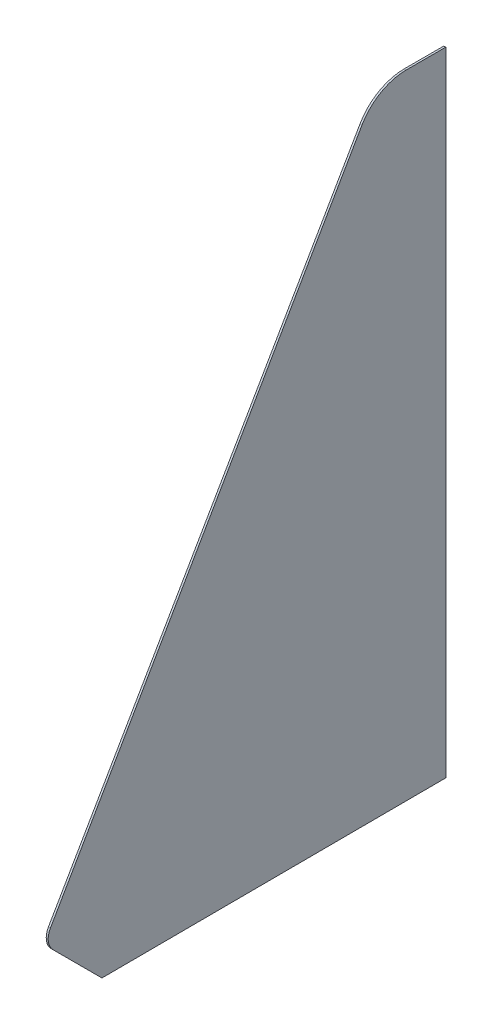
ISO-10303-21;
HEADER;
FILE_DESCRIPTION(('STEP AP214'),'2;1');
FILE_NAME('part.step','',(''),(''),'','','');
FILE_SCHEMA(('AUTOMOTIVE_DESIGN { 1 0 10303 214 1 1 1 1 }'));
ENDSEC;
DATA;
#1=APPLICATION_CONTEXT('core data for automotive mechanical design processes');
#2=APPLICATION_PROTOCOL_DEFINITION('international standard','automotive_design',2000,#1);
#3=PRODUCT_CONTEXT('',#1,'mechanical');
#4=PRODUCT('Part','Part','',(#3));
#5=PRODUCT_RELATED_PRODUCT_CATEGORY('part','',(#4));
#6=PRODUCT_DEFINITION_FORMATION('','',#4);
#7=PRODUCT_DEFINITION_CONTEXT('part definition',#1,'design');
#8=PRODUCT_DEFINITION('design','',#6,#7);
#9=PRODUCT_DEFINITION_SHAPE('','',#8);
#10=(LENGTH_UNIT() NAMED_UNIT(*) SI_UNIT(.MILLI.,.METRE.));
#11=(NAMED_UNIT(*) PLANE_ANGLE_UNIT() SI_UNIT($,.RADIAN.));
#12=(NAMED_UNIT(*) SI_UNIT($,.STERADIAN.) SOLID_ANGLE_UNIT());
#13=UNCERTAINTY_MEASURE_WITH_UNIT(LENGTH_MEASURE(1.E-05),#10,'distance_accuracy_value','');
#14=(GEOMETRIC_REPRESENTATION_CONTEXT(3) GLOBAL_UNCERTAINTY_ASSIGNED_CONTEXT((#13)) GLOBAL_UNIT_ASSIGNED_CONTEXT((#10,
#11,#12)) REPRESENTATION_CONTEXT('',''));
#15=CARTESIAN_POINT('',(0.,0.,0.));
#16=DIRECTION('',(0.,0.,1.));
#17=DIRECTION('',(1.,0.,0.));
#18=AXIS2_PLACEMENT_3D('',#15,#16,#17);
#19=CARTESIAN_POINT('',(0.,589.999999999999,39.9999999999981));
#20=DIRECTION('',(-1.,0.,0.));
#21=DIRECTION('',(0.,0.,1.));
#22=AXIS2_PLACEMENT_3D('',#19,#20,#21);
#23=CYLINDRICAL_SURFACE('',#22,52.0000000000009);
#24=DIRECTION('',(1.,0.,0.));
#25=VECTOR('',#24,1.);
#26=CARTESIAN_POINT('',(0.,641.999999999999,39.9999999999981));
#27=LINE('',#26,#25);
#28=CARTESIAN_POINT('',(0.,641.999999999999,39.9999999999981));
#29=VERTEX_POINT('',#28);
#30=CARTESIAN_POINT('',(2.,641.999999999999,39.9999999999981));
#31=VERTEX_POINT('',#30);
#32=EDGE_CURVE('E11',#29,#31,#27,.T.);
#33=ORIENTED_EDGE('',*,*,#32,.F.);
#34=CARTESIAN_POINT('',(0.,589.999999999999,39.9999999999981));
#35=DIRECTION('',(1.,0.,0.));
#36=DIRECTION('',(0.,0.,-1.));
#37=AXIS2_PLACEMENT_3D('',#34,#35,#36);
#38=CIRCLE('',#37,52.0000000000009);
#39=CARTESIAN_POINT('',(0.,615.999999999999,85.0333209967898));
#40=VERTEX_POINT('',#39);
#41=EDGE_CURVE('E150',#29,#40,#38,.T.);
#42=ORIENTED_EDGE('',*,*,#41,.T.);
#43=DIRECTION('',(1.,0.,0.));
#44=VECTOR('',#43,1.);
#45=CARTESIAN_POINT('',(0.,615.999999999999,85.0333209967898));
#46=LINE('',#45,#44);
#47=CARTESIAN_POINT('',(2.,615.999999999999,85.0333209967898));
#48=VERTEX_POINT('',#47);
#49=EDGE_CURVE('E58',#40,#48,#46,.T.);
#50=ORIENTED_EDGE('',*,*,#49,.T.);
#51=CARTESIAN_POINT('',(2.,589.999999999999,39.9999999999981));
#52=DIRECTION('',(1.,0.,0.));
#53=DIRECTION('',(0.,0.,-1.));
#54=AXIS2_PLACEMENT_3D('',#51,#52,#53);
#55=CIRCLE('',#54,52.0000000000009);
#56=EDGE_CURVE('E149',#31,#48,#55,.T.);
#57=ORIENTED_EDGE('',*,*,#56,.F.);
#58=EDGE_LOOP('',(#33,#42,#50,#57));
#59=FACE_BOUND('',#58,.T.);
#60=ADVANCED_FACE('F47',(#59),#23,.T.);
#61=CARTESIAN_POINT('',(0.,615.999999999999,85.0333209967898));
#62=DIRECTION('',(0.,-0.5,-0.866025403784439));
#63=DIRECTION('',(0.,-0.866025403784439,0.5));
#64=AXIS2_PLACEMENT_3D('',#61,#62,#63);
#65=PLANE('',#64);
#66=ORIENTED_EDGE('',*,*,#49,.F.);
#67=DIRECTION('',(0.,-0.866025403784439,0.5));
#68=VECTOR('',#67,1.);
#69=CARTESIAN_POINT('',(0.,615.999999999999,85.0333209967898));
#70=LINE('',#69,#68);
#71=CARTESIAN_POINT('',(0.,68.6719448082339,401.03332099679));
#72=VERTEX_POINT('',#71);
#73=EDGE_CURVE('E180',#40,#72,#70,.T.);
#74=ORIENTED_EDGE('',*,*,#73,.T.);
#75=DIRECTION('',(1.,0.,0.));
#76=VECTOR('',#75,1.);
#77=CARTESIAN_POINT('',(0.,68.6719448082339,401.03332099679));
#78=LINE('',#77,#76);
#79=CARTESIAN_POINT('',(2.,68.6719448082339,401.03332099679));
#80=VERTEX_POINT('',#79);
#81=EDGE_CURVE('E141',#72,#80,#78,.T.);
#82=ORIENTED_EDGE('',*,*,#81,.T.);
#83=DIRECTION('',(0.,-0.866025403784439,0.5));
#84=VECTOR('',#83,1.);
#85=CARTESIAN_POINT('',(2.,615.999999999999,85.0333209967898));
#86=LINE('',#85,#84);
#87=EDGE_CURVE('E160',#48,#80,#86,.T.);
#88=ORIENTED_EDGE('',*,*,#87,.F.);
#89=EDGE_LOOP('',(#66,#74,#82,#88));
#90=FACE_BOUND('',#89,.T.);
#91=ADVANCED_FACE('F165',(#90),#65,.F.);
#92=CARTESIAN_POINT('',(0.,60.1719448082339,386.310889132454));
#93=DIRECTION('',(-1.,0.,0.));
#94=DIRECTION('',(0.,0.,1.));
#95=AXIS2_PLACEMENT_3D('',#92,#93,#94);
#96=CYLINDRICAL_SURFACE('',#95,17.0000000000001);
#97=ORIENTED_EDGE('',*,*,#81,.F.);
#98=CARTESIAN_POINT('',(0.,60.1719448082339,386.310889132454));
#99=DIRECTION('',(1.,0.,0.));
#100=DIRECTION('',(0.,0.,1.));
#101=AXIS2_PLACEMENT_3D('',#98,#99,#100);
#102=CIRCLE('',#101,17.0000000000001);
#103=CARTESIAN_POINT('',(0.,48.1511295280625,398.331704412626));
#104=VERTEX_POINT('',#103);
#105=EDGE_CURVE('E132',#72,#104,#102,.T.);
#106=ORIENTED_EDGE('',*,*,#105,.T.);
#107=DIRECTION('',(1.,0.,0.));
#108=VECTOR('',#107,1.);
#109=CARTESIAN_POINT('',(0.,48.1511295280625,398.331704412626));
#110=LINE('',#109,#108);
#111=CARTESIAN_POINT('',(2.,48.1511295280625,398.331704412626));
#112=VERTEX_POINT('',#111);
#113=EDGE_CURVE('E138',#104,#112,#110,.T.);
#114=ORIENTED_EDGE('',*,*,#113,.T.);
#115=CARTESIAN_POINT('',(2.,60.1719448082339,386.310889132454));
#116=DIRECTION('',(1.,0.,0.));
#117=DIRECTION('',(0.,0.,-1.));
#118=AXIS2_PLACEMENT_3D('',#115,#116,#117);
#119=CIRCLE('',#118,17.0000000000001);
#120=EDGE_CURVE('E167',#80,#112,#119,.T.);
#121=ORIENTED_EDGE('',*,*,#120,.F.);
#122=EDGE_LOOP('',(#97,#106,#114,#121));
#123=FACE_BOUND('',#122,.T.);
#124=ADVANCED_FACE('F186',(#123),#96,.T.);
#125=CARTESIAN_POINT('',(0.,-1.41421356237309,348.76636132219));
#126=DIRECTION('',(0.,0.707106781186548,-0.707106781186547));
#127=DIRECTION('',(0.,-0.707106781186547,-0.707106781186548));
#128=AXIS2_PLACEMENT_3D('',#125,#126,#127);
#129=PLANE('',#128);
#130=ORIENTED_EDGE('',*,*,#113,.F.);
#131=DIRECTION('',(0.,-0.707106781186547,-0.707106781186548));
#132=VECTOR('',#131,1.);
#133=CARTESIAN_POINT('',(0.,-1.41421356237309,348.76636132219));
#134=LINE('',#133,#132);
#135=CARTESIAN_POINT('',(0.,-1.41421356237309,348.76636132219));
#136=VERTEX_POINT('',#135);
#137=EDGE_CURVE('E126',#104,#136,#134,.T.);
#138=ORIENTED_EDGE('',*,*,#137,.T.);
#139=DIRECTION('',(1.,0.,0.));
#140=VECTOR('',#139,1.);
#141=CARTESIAN_POINT('',(0.,-1.41421356237309,348.76636132219));
#142=LINE('',#141,#140);
#143=CARTESIAN_POINT('',(2.,-1.41421356237309,348.76636132219));
#144=VERTEX_POINT('',#143);
#145=EDGE_CURVE('E101',#136,#144,#142,.T.);
#146=ORIENTED_EDGE('',*,*,#145,.T.);
#147=DIRECTION('',(0.,-0.707106781186547,-0.707106781186548));
#148=VECTOR('',#147,1.);
#149=CARTESIAN_POINT('',(2.,-1.41421356237309,348.76636132219));
#150=LINE('',#149,#148);
#151=EDGE_CURVE('E170',#112,#144,#150,.T.);
#152=ORIENTED_EDGE('',*,*,#151,.F.);
#153=EDGE_LOOP('',(#130,#138,#146,#152));
#154=FACE_BOUND('',#153,.T.);
#155=ADVANCED_FACE('F188',(#154),#129,.F.);
#156=CARTESIAN_POINT('',(0.,0.,0.));
#157=DIRECTION('',(0.,0.999991778984563,0.00405486908410621));
#158=DIRECTION('',(0.,0.00405486908410621,-0.999991778984563));
#159=AXIS2_PLACEMENT_3D('',#156,#157,#158);
#160=PLANE('',#159);
#161=ORIENTED_EDGE('',*,*,#145,.F.);
#162=DIRECTION('',(0.,0.00405486908410621,-0.999991778984563));
#163=VECTOR('',#162,1.);
#164=CARTESIAN_POINT('',(0.,0.,0.));
#165=LINE('',#164,#163);
#166=CARTESIAN_POINT('',(0.,0.,0.));
#167=VERTEX_POINT('',#166);
#168=EDGE_CURVE('E118',#136,#167,#165,.T.);
#169=ORIENTED_EDGE('',*,*,#168,.T.);
#170=DIRECTION('',(1.,0.,0.));
#171=VECTOR('',#170,1.);
#172=CARTESIAN_POINT('',(0.,0.,0.));
#173=LINE('',#172,#171);
#174=CARTESIAN_POINT('',(2.,0.,0.));
#175=VERTEX_POINT('',#174);
#176=EDGE_CURVE('E66',#167,#175,#173,.T.);
#177=ORIENTED_EDGE('',*,*,#176,.T.);
#178=DIRECTION('',(0.,0.00405486908410621,-0.999991778984563));
#179=VECTOR('',#178,1.);
#180=CARTESIAN_POINT('',(2.,0.,0.));
#181=LINE('',#180,#179);
#182=EDGE_CURVE('E192',#144,#175,#181,.T.);
#183=ORIENTED_EDGE('',*,*,#182,.F.);
#184=EDGE_LOOP('',(#161,#169,#177,#183));
#185=FACE_BOUND('',#184,.T.);
#186=ADVANCED_FACE('F124',(#185),#160,.F.);
#187=CARTESIAN_POINT('',(0.,641.999999999999,0.));
#188=DIRECTION('',(0.,0.,1.));
#189=DIRECTION('',(0.,1.,0.));
#190=AXIS2_PLACEMENT_3D('',#187,#188,#189);
#191=PLANE('',#190);
#192=ORIENTED_EDGE('',*,*,#176,.F.);
#193=DIRECTION('',(0.,1.,0.));
#194=VECTOR('',#193,1.);
#195=CARTESIAN_POINT('',(0.,641.999999999999,0.));
#196=LINE('',#195,#194);
#197=CARTESIAN_POINT('',(0.,641.999999999999,0.));
#198=VERTEX_POINT('',#197);
#199=EDGE_CURVE('E107',#167,#198,#196,.T.);
#200=ORIENTED_EDGE('',*,*,#199,.T.);
#201=DIRECTION('',(1.,0.,0.));
#202=VECTOR('',#201,1.);
#203=CARTESIAN_POINT('',(0.,641.999999999999,0.));
#204=LINE('',#203,#202);
#205=CARTESIAN_POINT('',(2.,641.999999999999,0.));
#206=VERTEX_POINT('',#205);
#207=EDGE_CURVE('E51',#198,#206,#204,.T.);
#208=ORIENTED_EDGE('',*,*,#207,.T.);
#209=DIRECTION('',(0.,1.,0.));
#210=VECTOR('',#209,1.);
#211=CARTESIAN_POINT('',(2.,60.1719448082339,0.));
#212=LINE('',#211,#210);
#213=EDGE_CURVE('E109',#175,#206,#212,.T.);
#214=ORIENTED_EDGE('',*,*,#213,.F.);
#215=EDGE_LOOP('',(#192,#200,#208,#214));
#216=FACE_BOUND('',#215,.T.);
#217=ADVANCED_FACE('F106',(#216),#191,.F.);
#218=CARTESIAN_POINT('',(0.,641.999999999999,0.));
#219=DIRECTION('',(0.,-1.,0.));
#220=DIRECTION('',(0.,0.,1.));
#221=AXIS2_PLACEMENT_3D('',#218,#219,#220);
#222=PLANE('',#221);
#223=DIRECTION('',(0.,0.,1.));
#224=VECTOR('',#223,1.);
#225=CARTESIAN_POINT('',(0.,641.999999999999,0.));
#226=LINE('',#225,#224);
#227=EDGE_CURVE('E121',#198,#29,#226,.T.);
#228=ORIENTED_EDGE('',*,*,#227,.T.);
#229=ORIENTED_EDGE('',*,*,#32,.T.);
#230=DIRECTION('',(0.,0.,1.));
#231=VECTOR('',#230,1.);
#232=CARTESIAN_POINT('',(2.,641.999999999999,386.310889132454));
#233=LINE('',#232,#231);
#234=EDGE_CURVE('E130',#206,#31,#233,.T.);
#235=ORIENTED_EDGE('',*,*,#234,.F.);
#236=ORIENTED_EDGE('',*,*,#207,.F.);
#237=EDGE_LOOP('',(#228,#229,#235,#236));
#238=FACE_BOUND('',#237,.T.);
#239=ADVANCED_FACE('F49',(#238),#222,.F.);
#240=CARTESIAN_POINT('',(2.,60.1719448082339,386.310889132454));
#241=DIRECTION('',(-1.,0.,0.));
#242=DIRECTION('',(0.,0.,1.));
#243=AXIS2_PLACEMENT_3D('',#240,#241,#242);
#244=PLANE('',#243);
#245=ORIENTED_EDGE('',*,*,#213,.T.);
#246=ORIENTED_EDGE('',*,*,#234,.T.);
#247=ORIENTED_EDGE('',*,*,#56,.T.);
#248=ORIENTED_EDGE('',*,*,#87,.T.);
#249=ORIENTED_EDGE('',*,*,#120,.T.);
#250=ORIENTED_EDGE('',*,*,#151,.T.);
#251=ORIENTED_EDGE('',*,*,#182,.T.);
#252=EDGE_LOOP('',(#245,#246,#247,#248,#249,#250,#251));
#253=FACE_BOUND('',#252,.T.);
#254=ADVANCED_FACE('F158',(#253),#244,.F.);
#255=CARTESIAN_POINT('',(0.,60.1719448082339,386.310889132454));
#256=DIRECTION('',(-1.,0.,0.));
#257=DIRECTION('',(0.,0.,1.));
#258=AXIS2_PLACEMENT_3D('',#255,#256,#257);
#259=PLANE('',#258);
#260=ORIENTED_EDGE('',*,*,#199,.F.);
#261=ORIENTED_EDGE('',*,*,#168,.F.);
#262=ORIENTED_EDGE('',*,*,#137,.F.);
#263=ORIENTED_EDGE('',*,*,#105,.F.);
#264=ORIENTED_EDGE('',*,*,#73,.F.);
#265=ORIENTED_EDGE('',*,*,#41,.F.);
#266=ORIENTED_EDGE('',*,*,#227,.F.);
#267=EDGE_LOOP('',(#260,#261,#262,#263,#264,#265,#266));
#268=FACE_BOUND('',#267,.T.);
#269=ADVANCED_FACE('F116',(#268),#259,.T.);
#270=CLOSED_SHELL('',(#60,#91,#124,#155,#186,#217,#239,#254,#269));
#271=MANIFOLD_SOLID_BREP('B2',#270);
#272=ADVANCED_BREP_SHAPE_REPRESENTATION('',(#18,#271),#14);
#273=SHAPE_DEFINITION_REPRESENTATION(#9,#272);
ENDSEC;
END-ISO-10303-21;
